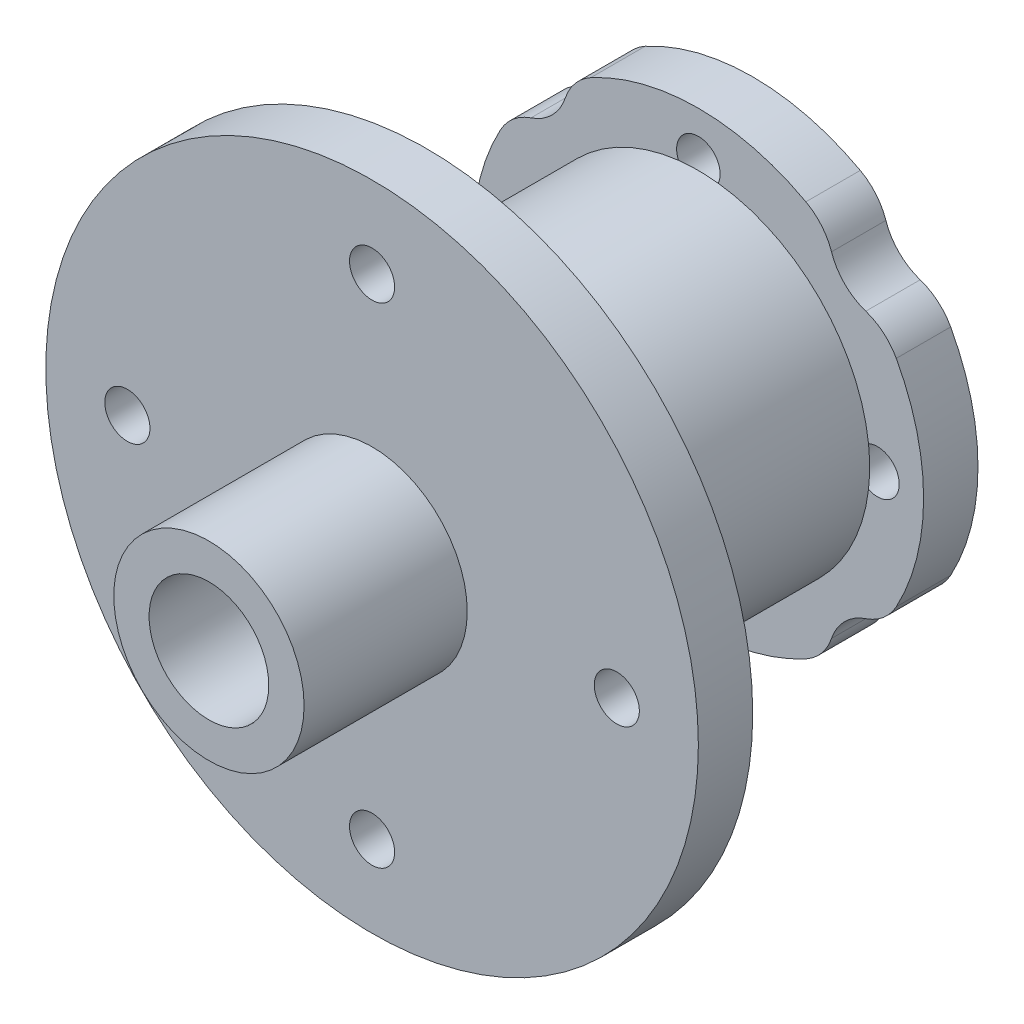
ISO-10303-21;
HEADER;
FILE_DESCRIPTION(('STEP AP214'),'2;1');
FILE_NAME('part.step','',(''),(''),'','','');
FILE_SCHEMA(('AUTOMOTIVE_DESIGN { 1 0 10303 214 1 1 1 1 }'));
ENDSEC;
DATA;
#1=APPLICATION_CONTEXT('core data for automotive mechanical design processes');
#2=APPLICATION_PROTOCOL_DEFINITION('international standard','automotive_design',2000,#1);
#3=PRODUCT_CONTEXT('',#1,'mechanical');
#4=PRODUCT('Part','Part','',(#3));
#5=PRODUCT_RELATED_PRODUCT_CATEGORY('part','',(#4));
#6=PRODUCT_DEFINITION_FORMATION('','',#4);
#7=PRODUCT_DEFINITION_CONTEXT('part definition',#1,'design');
#8=PRODUCT_DEFINITION('design','',#6,#7);
#9=PRODUCT_DEFINITION_SHAPE('','',#8);
#10=(LENGTH_UNIT() NAMED_UNIT(*) SI_UNIT(.MILLI.,.METRE.));
#11=(NAMED_UNIT(*) PLANE_ANGLE_UNIT() SI_UNIT($,.RADIAN.));
#12=(NAMED_UNIT(*) SI_UNIT($,.STERADIAN.) SOLID_ANGLE_UNIT());
#13=UNCERTAINTY_MEASURE_WITH_UNIT(LENGTH_MEASURE(1.E-05),#10,'distance_accuracy_value','');
#14=(GEOMETRIC_REPRESENTATION_CONTEXT(3) GLOBAL_UNCERTAINTY_ASSIGNED_CONTEXT((#13)) GLOBAL_UNIT_ASSIGNED_CONTEXT((#10,
#11,#12)) REPRESENTATION_CONTEXT('',''));
#15=CARTESIAN_POINT('',(0.,0.,0.));
#16=DIRECTION('',(0.,0.,1.));
#17=DIRECTION('',(1.,0.,0.));
#18=AXIS2_PLACEMENT_3D('',#15,#16,#17);
#19=CARTESIAN_POINT('',(0.,0.,10.));
#20=DIRECTION('',(0.,0.,-1.));
#21=DIRECTION('',(-1.,0.,0.));
#22=AXIS2_PLACEMENT_3D('',#19,#20,#21);
#23=CYLINDRICAL_SURFACE('',#22,41.42);
#24=CARTESIAN_POINT('',(0.,0.,10.));
#25=DIRECTION('',(0.,0.,1.));
#26=DIRECTION('',(1.,0.,0.));
#27=AXIS2_PLACEMENT_3D('',#24,#25,#26);
#28=CIRCLE('',#27,41.42);
#29=CARTESIAN_POINT('',(-36.3951118421899,19.7740292807129,10.));
#30=VERTEX_POINT('',#29);
#31=CARTESIAN_POINT('',(-36.3951118421899,-19.7740292807129,10.));
#32=VERTEX_POINT('',#31);
#33=EDGE_CURVE('E260',#30,#32,#28,.T.);
#34=ORIENTED_EDGE('',*,*,#33,.F.);
#35=DIRECTION('',(0.,0.,-1.));
#36=VECTOR('',#35,1.);
#37=CARTESIAN_POINT('',(-36.3951118421899,19.7740292807129,10.));
#38=LINE('',#37,#36);
#39=CARTESIAN_POINT('',(-36.3951118421899,19.7740292807129,0.));
#40=VERTEX_POINT('',#39);
#41=EDGE_CURVE('E262',#30,#40,#38,.T.);
#42=ORIENTED_EDGE('',*,*,#41,.T.);
#43=CARTESIAN_POINT('',(0.,0.,0.));
#44=DIRECTION('',(0.,0.,1.));
#45=DIRECTION('',(1.,0.,0.));
#46=AXIS2_PLACEMENT_3D('',#43,#44,#45);
#47=CIRCLE('',#46,41.42);
#48=CARTESIAN_POINT('',(-36.3951118421899,-19.7740292807129,0.));
#49=VERTEX_POINT('',#48);
#50=EDGE_CURVE('E211',#40,#49,#47,.T.);
#51=ORIENTED_EDGE('',*,*,#50,.T.);
#52=DIRECTION('',(0.,0.,-1.));
#53=VECTOR('',#52,1.);
#54=CARTESIAN_POINT('',(-36.3951118421899,-19.7740292807129,10.));
#55=LINE('',#54,#53);
#56=EDGE_CURVE('E236',#49,#32,#55,.F.);
#57=ORIENTED_EDGE('',*,*,#56,.T.);
#58=EDGE_LOOP('',(#34,#42,#51,#57));
#59=FACE_BOUND('',#58,.T.);
#60=ADVANCED_FACE('F39',(#59),#23,.T.);
#61=CARTESIAN_POINT('',(0.,0.,10.));
#62=DIRECTION('',(0.,0.,-1.));
#63=DIRECTION('',(-1.,0.,0.));
#64=AXIS2_PLACEMENT_3D('',#61,#62,#63);
#65=CYLINDRICAL_SURFACE('',#64,41.42);
#66=CARTESIAN_POINT('',(0.,0.,10.));
#67=DIRECTION('',(0.,0.,1.));
#68=DIRECTION('',(1.,0.,0.));
#69=AXIS2_PLACEMENT_3D('',#66,#67,#68);
#70=CIRCLE('',#69,41.42);
#71=CARTESIAN_POINT('',(-19.7740292807129,-36.3951118421899,10.));
#72=VERTEX_POINT('',#71);
#73=CARTESIAN_POINT('',(19.7740292807129,-36.3951118421899,10.));
#74=VERTEX_POINT('',#73);
#75=EDGE_CURVE('E430',#72,#74,#70,.T.);
#76=ORIENTED_EDGE('',*,*,#75,.F.);
#77=DIRECTION('',(0.,0.,-1.));
#78=VECTOR('',#77,1.);
#79=CARTESIAN_POINT('',(-19.7740292807129,-36.3951118421899,10.));
#80=LINE('',#79,#78);
#81=CARTESIAN_POINT('',(-19.7740292807129,-36.3951118421899,0.));
#82=VERTEX_POINT('',#81);
#83=EDGE_CURVE('E307',#72,#82,#80,.T.);
#84=ORIENTED_EDGE('',*,*,#83,.T.);
#85=CARTESIAN_POINT('',(0.,0.,0.));
#86=DIRECTION('',(0.,0.,1.));
#87=DIRECTION('',(1.,0.,0.));
#88=AXIS2_PLACEMENT_3D('',#85,#86,#87);
#89=CIRCLE('',#88,41.42);
#90=CARTESIAN_POINT('',(19.7740292807129,-36.3951118421899,0.));
#91=VERTEX_POINT('',#90);
#92=EDGE_CURVE('E239',#82,#91,#89,.T.);
#93=ORIENTED_EDGE('',*,*,#92,.T.);
#94=DIRECTION('',(0.,0.,-1.));
#95=VECTOR('',#94,1.);
#96=CARTESIAN_POINT('',(19.7740292807129,-36.3951118421899,10.));
#97=LINE('',#96,#95);
#98=EDGE_CURVE('E305',#91,#74,#97,.F.);
#99=ORIENTED_EDGE('',*,*,#98,.T.);
#100=EDGE_LOOP('',(#76,#84,#93,#99));
#101=FACE_BOUND('',#100,.T.);
#102=ADVANCED_FACE('F429',(#101),#65,.T.);
#103=CARTESIAN_POINT('',(0.,0.,10.));
#104=DIRECTION('',(0.,0.,-1.));
#105=DIRECTION('',(-1.,0.,0.));
#106=AXIS2_PLACEMENT_3D('',#103,#104,#105);
#107=CYLINDRICAL_SURFACE('',#106,41.42);
#108=CARTESIAN_POINT('',(0.,0.,10.));
#109=DIRECTION('',(0.,0.,1.));
#110=DIRECTION('',(1.,0.,0.));
#111=AXIS2_PLACEMENT_3D('',#108,#109,#110);
#112=CIRCLE('',#111,41.42);
#113=CARTESIAN_POINT('',(36.3951118421899,-19.7740292807129,10.));
#114=VERTEX_POINT('',#113);
#115=CARTESIAN_POINT('',(36.3951118421899,19.7740292807129,10.));
#116=VERTEX_POINT('',#115);
#117=EDGE_CURVE('E377',#114,#116,#112,.T.);
#118=ORIENTED_EDGE('',*,*,#117,.F.);
#119=DIRECTION('',(0.,0.,-1.));
#120=VECTOR('',#119,1.);
#121=CARTESIAN_POINT('',(36.3951118421899,-19.7740292807129,10.));
#122=LINE('',#121,#120);
#123=CARTESIAN_POINT('',(36.3951118421899,-19.7740292807129,0.));
#124=VERTEX_POINT('',#123);
#125=EDGE_CURVE('E312',#114,#124,#122,.T.);
#126=ORIENTED_EDGE('',*,*,#125,.T.);
#127=CARTESIAN_POINT('',(0.,0.,0.));
#128=DIRECTION('',(0.,0.,1.));
#129=DIRECTION('',(1.,0.,0.));
#130=AXIS2_PLACEMENT_3D('',#127,#128,#129);
#131=CIRCLE('',#130,41.42);
#132=CARTESIAN_POINT('',(36.3951118421899,19.7740292807129,0.));
#133=VERTEX_POINT('',#132);
#134=EDGE_CURVE('E242',#124,#133,#131,.T.);
#135=ORIENTED_EDGE('',*,*,#134,.T.);
#136=DIRECTION('',(0.,0.,-1.));
#137=VECTOR('',#136,1.);
#138=CARTESIAN_POINT('',(36.3951118421899,19.7740292807129,10.));
#139=LINE('',#138,#137);
#140=EDGE_CURVE('E310',#133,#116,#139,.F.);
#141=ORIENTED_EDGE('',*,*,#140,.T.);
#142=EDGE_LOOP('',(#118,#126,#135,#141));
#143=FACE_BOUND('',#142,.T.);
#144=ADVANCED_FACE('F375',(#143),#107,.T.);
#145=CARTESIAN_POINT('',(0.,-32.935,10.));
#146=DIRECTION('',(0.,0.,-1.));
#147=DIRECTION('',(-1.,0.,0.));
#148=AXIS2_PLACEMENT_3D('',#145,#146,#147);
#149=CYLINDRICAL_SURFACE('',#148,4.);
#150=CARTESIAN_POINT('',(0.,-32.935,10.));
#151=DIRECTION('',(0.,0.,1.));
#152=DIRECTION('',(1.,0.,0.));
#153=AXIS2_PLACEMENT_3D('',#150,#151,#152);
#154=CIRCLE('',#153,4.);
#155=CARTESIAN_POINT('',(3.6453496815203,-31.2883592682557,10.));
#156=VERTEX_POINT('',#155);
#157=CARTESIAN_POINT('',(-3.64534968152038,-31.2883592682556,10.));
#158=VERTEX_POINT('',#157);
#159=EDGE_CURVE('E232',#156,#158,#154,.T.);
#160=ORIENTED_EDGE('',*,*,#159,.T.);
#161=EDGE_CURVE('E184',#158,#156,#154,.T.);
#162=ORIENTED_EDGE('',*,*,#161,.T.);
#163=EDGE_LOOP('',(#160,#162));
#164=FACE_BOUND('',#163,.T.);
#165=CARTESIAN_POINT('',(0.,-32.935,0.));
#166=DIRECTION('',(0.,0.,1.));
#167=DIRECTION('',(1.,0.,0.));
#168=AXIS2_PLACEMENT_3D('',#165,#166,#167);
#169=CIRCLE('',#168,4.);
#170=CARTESIAN_POINT('',(3.99999999999996,-32.935,0.));
#171=VERTEX_POINT('',#170);
#172=EDGE_CURVE('E254',#171,#171,#169,.T.);
#173=ORIENTED_EDGE('',*,*,#172,.F.);
#174=EDGE_LOOP('',(#173));
#175=FACE_BOUND('',#174,.T.);
#176=ADVANCED_FACE('F438',(#164,#175),#149,.F.);
#177=CARTESIAN_POINT('',(32.935,0.,10.));
#178=DIRECTION('',(0.,0.,-1.));
#179=DIRECTION('',(-1.,0.,0.));
#180=AXIS2_PLACEMENT_3D('',#177,#178,#179);
#181=CYLINDRICAL_SURFACE('',#180,4.00000000000001);
#182=CARTESIAN_POINT('',(32.935,0.,10.));
#183=DIRECTION('',(0.,0.,1.));
#184=DIRECTION('',(1.,0.,0.));
#185=AXIS2_PLACEMENT_3D('',#182,#183,#184);
#186=CIRCLE('',#185,4.00000000000001);
#187=CARTESIAN_POINT('',(31.2883592682557,3.64534968152034,10.));
#188=VERTEX_POINT('',#187);
#189=CARTESIAN_POINT('',(31.2883592682556,-3.64534968152037,10.));
#190=VERTEX_POINT('',#189);
#191=EDGE_CURVE('E176',#188,#190,#186,.T.);
#192=ORIENTED_EDGE('',*,*,#191,.T.);
#193=EDGE_CURVE('E180',#190,#188,#186,.T.);
#194=ORIENTED_EDGE('',*,*,#193,.T.);
#195=EDGE_LOOP('',(#192,#194));
#196=FACE_BOUND('',#195,.T.);
#197=CARTESIAN_POINT('',(32.935,0.,0.));
#198=DIRECTION('',(0.,0.,1.));
#199=DIRECTION('',(1.,0.,0.));
#200=AXIS2_PLACEMENT_3D('',#197,#198,#199);
#201=CIRCLE('',#200,4.00000000000001);
#202=CARTESIAN_POINT('',(36.935,0.,0.));
#203=VERTEX_POINT('',#202);
#204=EDGE_CURVE('E251',#203,#203,#201,.T.);
#205=ORIENTED_EDGE('',*,*,#204,.F.);
#206=EDGE_LOOP('',(#205));
#207=FACE_BOUND('',#206,.T.);
#208=ADVANCED_FACE('F178',(#196,#207),#181,.F.);
#209=CARTESIAN_POINT('',(0.,32.935,10.));
#210=DIRECTION('',(0.,0.,-1.));
#211=DIRECTION('',(-1.,0.,0.));
#212=AXIS2_PLACEMENT_3D('',#209,#210,#211);
#213=CYLINDRICAL_SURFACE('',#212,4.);
#214=CARTESIAN_POINT('',(0.,32.935,10.));
#215=DIRECTION('',(0.,0.,1.));
#216=DIRECTION('',(1.,0.,0.));
#217=AXIS2_PLACEMENT_3D('',#214,#215,#216);
#218=CIRCLE('',#217,4.);
#219=CARTESIAN_POINT('',(-3.64534968152036,31.2883592682557,10.));
#220=VERTEX_POINT('',#219);
#221=CARTESIAN_POINT('',(3.64534968152033,31.2883592682557,10.));
#222=VERTEX_POINT('',#221);
#223=EDGE_CURVE('E193',#220,#222,#218,.T.);
#224=ORIENTED_EDGE('',*,*,#223,.T.);
#225=EDGE_CURVE('E218',#222,#220,#218,.T.);
#226=ORIENTED_EDGE('',*,*,#225,.T.);
#227=EDGE_LOOP('',(#224,#226));
#228=FACE_BOUND('',#227,.T.);
#229=CARTESIAN_POINT('',(0.,32.935,0.));
#230=DIRECTION('',(0.,0.,1.));
#231=DIRECTION('',(1.,0.,0.));
#232=AXIS2_PLACEMENT_3D('',#229,#230,#231);
#233=CIRCLE('',#232,4.);
#234=CARTESIAN_POINT('',(3.99999999999999,32.935,0.));
#235=VERTEX_POINT('',#234);
#236=EDGE_CURVE('E248',#235,#235,#233,.T.);
#237=ORIENTED_EDGE('',*,*,#236,.F.);
#238=EDGE_LOOP('',(#237));
#239=FACE_BOUND('',#238,.T.);
#240=ADVANCED_FACE('F223',(#228,#239),#213,.F.);
#241=CARTESIAN_POINT('',(0.,0.,10.));
#242=DIRECTION('',(0.,0.,-1.));
#243=DIRECTION('',(-1.,0.,0.));
#244=AXIS2_PLACEMENT_3D('',#241,#242,#243);
#245=CYLINDRICAL_SURFACE('',#244,41.42);
#246=CARTESIAN_POINT('',(0.,0.,10.));
#247=DIRECTION('',(0.,0.,1.));
#248=DIRECTION('',(1.,0.,0.));
#249=AXIS2_PLACEMENT_3D('',#246,#247,#248);
#250=CIRCLE('',#249,41.42);
#251=CARTESIAN_POINT('',(19.7740292807129,36.3951118421899,10.));
#252=VERTEX_POINT('',#251);
#253=CARTESIAN_POINT('',(-19.7740292807129,36.3951118421899,10.));
#254=VERTEX_POINT('',#253);
#255=EDGE_CURVE('E225',#252,#254,#250,.T.);
#256=ORIENTED_EDGE('',*,*,#255,.F.);
#257=DIRECTION('',(0.,0.,-1.));
#258=VECTOR('',#257,1.);
#259=CARTESIAN_POINT('',(19.7740292807129,36.3951118421899,10.));
#260=LINE('',#259,#258);
#261=CARTESIAN_POINT('',(19.7740292807129,36.3951118421899,0.));
#262=VERTEX_POINT('',#261);
#263=EDGE_CURVE('E317',#252,#262,#260,.T.);
#264=ORIENTED_EDGE('',*,*,#263,.T.);
#265=CARTESIAN_POINT('',(0.,0.,0.));
#266=DIRECTION('',(0.,0.,1.));
#267=DIRECTION('',(1.,0.,0.));
#268=AXIS2_PLACEMENT_3D('',#265,#266,#267);
#269=CIRCLE('',#268,41.42);
#270=CARTESIAN_POINT('',(-19.7740292807129,36.3951118421899,0.));
#271=VERTEX_POINT('',#270);
#272=EDGE_CURVE('E245',#262,#271,#269,.T.);
#273=ORIENTED_EDGE('',*,*,#272,.T.);
#274=DIRECTION('',(0.,0.,-1.));
#275=VECTOR('',#274,1.);
#276=CARTESIAN_POINT('',(-19.7740292807129,36.3951118421899,10.));
#277=LINE('',#276,#275);
#278=EDGE_CURVE('E315',#271,#254,#277,.F.);
#279=ORIENTED_EDGE('',*,*,#278,.T.);
#280=EDGE_LOOP('',(#256,#264,#273,#279));
#281=FACE_BOUND('',#280,.T.);
#282=ADVANCED_FACE('F395',(#281),#245,.T.);
#283=CARTESIAN_POINT('',(-32.935,0.,10.));
#284=DIRECTION('',(0.,0.,-1.));
#285=DIRECTION('',(-1.,0.,0.));
#286=AXIS2_PLACEMENT_3D('',#283,#284,#285);
#287=CYLINDRICAL_SURFACE('',#286,4.);
#288=CARTESIAN_POINT('',(-32.935,0.,10.));
#289=DIRECTION('',(0.,0.,1.));
#290=DIRECTION('',(1.,0.,0.));
#291=AXIS2_PLACEMENT_3D('',#288,#289,#290);
#292=CIRCLE('',#291,4.);
#293=CARTESIAN_POINT('',(-31.2883592682557,3.64534968152032,10.));
#294=VERTEX_POINT('',#293);
#295=CARTESIAN_POINT('',(-31.2883592682557,-3.64534968152033,10.));
#296=VERTEX_POINT('',#295);
#297=EDGE_CURVE('E220',#294,#296,#292,.T.);
#298=ORIENTED_EDGE('',*,*,#297,.T.);
#299=EDGE_CURVE('E60',#296,#294,#292,.T.);
#300=ORIENTED_EDGE('',*,*,#299,.T.);
#301=EDGE_LOOP('',(#298,#300));
#302=FACE_BOUND('',#301,.T.);
#303=CARTESIAN_POINT('',(-32.935,0.,0.));
#304=DIRECTION('',(0.,0.,1.));
#305=DIRECTION('',(1.,0.,0.));
#306=AXIS2_PLACEMENT_3D('',#303,#304,#305);
#307=CIRCLE('',#306,4.);
#308=CARTESIAN_POINT('',(-28.935,0.,0.));
#309=VERTEX_POINT('',#308);
#310=EDGE_CURVE('E257',#309,#309,#307,.T.);
#311=ORIENTED_EDGE('',*,*,#310,.F.);
#312=EDGE_LOOP('',(#311));
#313=FACE_BOUND('',#312,.T.);
#314=ADVANCED_FACE('F504',(#302,#313),#287,.F.);
#315=CARTESIAN_POINT('',(0.,0.,10.));
#316=DIRECTION('',(0.,0.,1.));
#317=DIRECTION('',(1.,0.,0.));
#318=AXIS2_PLACEMENT_3D('',#315,#316,#317);
#319=PLANE('',#318);
#320=CARTESIAN_POINT('',(0.,0.,10.));
#321=DIRECTION('',(0.,0.,1.));
#322=DIRECTION('',(1.,0.,0.));
#323=AXIS2_PLACEMENT_3D('',#320,#321,#322);
#324=CIRCLE('',#323,31.5);
#325=EDGE_CURVE('E192',#188,#222,#324,.T.);
#326=ORIENTED_EDGE('',*,*,#325,.F.);
#327=ORIENTED_EDGE('',*,*,#193,.F.);
#328=EDGE_CURVE('E189',#156,#190,#324,.T.);
#329=ORIENTED_EDGE('',*,*,#328,.F.);
#330=ORIENTED_EDGE('',*,*,#161,.F.);
#331=EDGE_CURVE('E54',#296,#158,#324,.T.);
#332=ORIENTED_EDGE('',*,*,#331,.F.);
#333=ORIENTED_EDGE('',*,*,#297,.F.);
#334=EDGE_CURVE('E47',#220,#294,#324,.T.);
#335=ORIENTED_EDGE('',*,*,#334,.F.);
#336=ORIENTED_EDGE('',*,*,#225,.F.);
#337=EDGE_LOOP('',(#326,#327,#329,#330,#332,#333,#335,#336));
#338=FACE_BOUND('',#337,.T.);
#339=CARTESIAN_POINT('',(-15.,27.6082668778756,10.));
#340=DIRECTION('',(0.,0.,1.));
#341=DIRECTION('',(1.,0.,0.));
#342=AXIS2_PLACEMENT_3D('',#339,#340,#341);
#343=CIRCLE('',#342,10.);
#344=CARTESIAN_POINT('',(-24.4817172150347,30.7858506539725,10.));
#345=VERTEX_POINT('',#344);
#346=EDGE_CURVE('E285',#254,#345,#343,.T.);
#347=ORIENTED_EDGE('',*,*,#346,.T.);
#348=CARTESIAN_POINT('',(-33.9634344300694,33.9634344300694,10.));
#349=DIRECTION('',(0.,0.,1.));
#350=DIRECTION('',(1.,0.,0.));
#351=AXIS2_PLACEMENT_3D('',#348,#349,#350);
#352=CIRCLE('',#351,10.);
#353=CARTESIAN_POINT('',(-30.7858506539725,24.4817172150347,10.));
#354=VERTEX_POINT('',#353);
#355=EDGE_CURVE('E346',#345,#354,#352,.F.);
#356=ORIENTED_EDGE('',*,*,#355,.T.);
#357=CARTESIAN_POINT('',(-27.6082668778755,15.,10.));
#358=DIRECTION('',(0.,0.,1.));
#359=DIRECTION('',(1.,0.,0.));
#360=AXIS2_PLACEMENT_3D('',#357,#358,#359);
#361=CIRCLE('',#360,10.);
#362=EDGE_CURVE('E303',#354,#30,#361,.T.);
#363=ORIENTED_EDGE('',*,*,#362,.T.);
#364=ORIENTED_EDGE('',*,*,#33,.T.);
#365=CARTESIAN_POINT('',(-27.6082668778755,-15.,10.));
#366=DIRECTION('',(0.,0.,1.));
#367=DIRECTION('',(1.,0.,0.));
#368=AXIS2_PLACEMENT_3D('',#365,#366,#367);
#369=CIRCLE('',#368,10.);
#370=CARTESIAN_POINT('',(-30.7858506539725,-24.4817172150347,10.));
#371=VERTEX_POINT('',#370);
#372=EDGE_CURVE('E300',#32,#371,#369,.T.);
#373=ORIENTED_EDGE('',*,*,#372,.T.);
#374=CARTESIAN_POINT('',(-33.9634344300694,-33.9634344300694,10.));
#375=DIRECTION('',(0.,0.,1.));
#376=DIRECTION('',(1.,0.,0.));
#377=AXIS2_PLACEMENT_3D('',#374,#375,#376);
#378=CIRCLE('',#377,10.);
#379=CARTESIAN_POINT('',(-24.4817172150347,-30.7858506539725,10.));
#380=VERTEX_POINT('',#379);
#381=EDGE_CURVE('E350',#371,#380,#378,.F.);
#382=ORIENTED_EDGE('',*,*,#381,.T.);
#383=CARTESIAN_POINT('',(-15.,-27.6082668778756,10.));
#384=DIRECTION('',(0.,0.,1.));
#385=DIRECTION('',(1.,0.,0.));
#386=AXIS2_PLACEMENT_3D('',#383,#384,#385);
#387=CIRCLE('',#386,10.);
#388=EDGE_CURVE('E298',#380,#72,#387,.T.);
#389=ORIENTED_EDGE('',*,*,#388,.T.);
#390=ORIENTED_EDGE('',*,*,#75,.T.);
#391=CARTESIAN_POINT('',(15.,-27.6082668778755,10.));
#392=DIRECTION('',(0.,0.,1.));
#393=DIRECTION('',(1.,0.,0.));
#394=AXIS2_PLACEMENT_3D('',#391,#392,#393);
#395=CIRCLE('',#394,10.);
#396=CARTESIAN_POINT('',(24.4817172150347,-30.7858506539725,10.));
#397=VERTEX_POINT('',#396);
#398=EDGE_CURVE('E295',#74,#397,#395,.T.);
#399=ORIENTED_EDGE('',*,*,#398,.T.);
#400=CARTESIAN_POINT('',(33.9634344300694,-33.9634344300694,10.));
#401=DIRECTION('',(0.,0.,1.));
#402=DIRECTION('',(1.,0.,0.));
#403=AXIS2_PLACEMENT_3D('',#400,#401,#402);
#404=CIRCLE('',#403,10.);
#405=CARTESIAN_POINT('',(30.7858506539725,-24.4817172150347,10.));
#406=VERTEX_POINT('',#405);
#407=EDGE_CURVE('E203',#397,#406,#404,.F.);
#408=ORIENTED_EDGE('',*,*,#407,.T.);
#409=CARTESIAN_POINT('',(27.6082668778755,-15.,10.));
#410=DIRECTION('',(0.,0.,1.));
#411=DIRECTION('',(1.,0.,0.));
#412=AXIS2_PLACEMENT_3D('',#409,#410,#411);
#413=CIRCLE('',#412,10.);
#414=EDGE_CURVE('E293',#406,#114,#413,.T.);
#415=ORIENTED_EDGE('',*,*,#414,.T.);
#416=ORIENTED_EDGE('',*,*,#117,.T.);
#417=CARTESIAN_POINT('',(27.6082668778755,15.,10.));
#418=DIRECTION('',(0.,0.,1.));
#419=DIRECTION('',(1.,0.,0.));
#420=AXIS2_PLACEMENT_3D('',#417,#418,#419);
#421=CIRCLE('',#420,10.);
#422=CARTESIAN_POINT('',(30.7858506539725,24.4817172150347,10.));
#423=VERTEX_POINT('',#422);
#424=EDGE_CURVE('E290',#116,#423,#421,.T.);
#425=ORIENTED_EDGE('',*,*,#424,.T.);
#426=CARTESIAN_POINT('',(33.9634344300694,33.9634344300694,10.));
#427=DIRECTION('',(0.,0.,1.));
#428=DIRECTION('',(1.,0.,0.));
#429=AXIS2_PLACEMENT_3D('',#426,#427,#428);
#430=CIRCLE('',#429,10.);
#431=CARTESIAN_POINT('',(24.4817172150347,30.7858506539725,10.));
#432=VERTEX_POINT('',#431);
#433=EDGE_CURVE('E342',#423,#432,#430,.F.);
#434=ORIENTED_EDGE('',*,*,#433,.T.);
#435=CARTESIAN_POINT('',(15.,27.6082668778755,10.));
#436=DIRECTION('',(0.,0.,1.));
#437=DIRECTION('',(1.,0.,0.));
#438=AXIS2_PLACEMENT_3D('',#435,#436,#437);
#439=CIRCLE('',#438,10.);
#440=EDGE_CURVE('E288',#432,#252,#439,.T.);
#441=ORIENTED_EDGE('',*,*,#440,.T.);
#442=ORIENTED_EDGE('',*,*,#255,.T.);
#443=EDGE_LOOP('',(#347,#356,#363,#364,#373,#382,#389,#390,#399,#408,#415,#416,#425,#434,#441,#442));
#444=FACE_BOUND('',#443,.T.);
#445=ADVANCED_FACE('F186',(#338,#444),#319,.T.);
#446=CARTESIAN_POINT('',(0.,0.,0.));
#447=DIRECTION('',(0.,0.,1.));
#448=DIRECTION('',(1.,0.,0.));
#449=AXIS2_PLACEMENT_3D('',#446,#447,#448);
#450=PLANE('',#449);
#451=ORIENTED_EDGE('',*,*,#50,.F.);
#452=CARTESIAN_POINT('',(-27.6082668778755,15.,0.));
#453=DIRECTION('',(0.,0.,1.));
#454=DIRECTION('',(1.,0.,0.));
#455=AXIS2_PLACEMENT_3D('',#452,#453,#454);
#456=CIRCLE('',#455,10.);
#457=CARTESIAN_POINT('',(-30.7858506539725,24.4817172150347,0.));
#458=VERTEX_POINT('',#457);
#459=EDGE_CURVE('E282',#40,#458,#456,.F.);
#460=ORIENTED_EDGE('',*,*,#459,.T.);
#461=CARTESIAN_POINT('',(-33.9634344300694,33.9634344300694,0.));
#462=DIRECTION('',(0.,0.,1.));
#463=DIRECTION('',(1.,0.,0.));
#464=AXIS2_PLACEMENT_3D('',#461,#462,#463);
#465=CIRCLE('',#464,10.);
#466=CARTESIAN_POINT('',(-24.4817172150347,30.7858506539725,0.));
#467=VERTEX_POINT('',#466);
#468=EDGE_CURVE('E344',#458,#467,#465,.T.);
#469=ORIENTED_EDGE('',*,*,#468,.T.);
#470=CARTESIAN_POINT('',(-15.,27.6082668778756,0.));
#471=DIRECTION('',(0.,0.,1.));
#472=DIRECTION('',(1.,0.,0.));
#473=AXIS2_PLACEMENT_3D('',#470,#471,#472);
#474=CIRCLE('',#473,10.);
#475=EDGE_CURVE('E265',#467,#271,#474,.F.);
#476=ORIENTED_EDGE('',*,*,#475,.T.);
#477=ORIENTED_EDGE('',*,*,#272,.F.);
#478=CARTESIAN_POINT('',(15.,27.6082668778755,0.));
#479=DIRECTION('',(0.,0.,1.));
#480=DIRECTION('',(1.,0.,0.));
#481=AXIS2_PLACEMENT_3D('',#478,#479,#480);
#482=CIRCLE('',#481,10.);
#483=CARTESIAN_POINT('',(24.4817172150347,30.7858506539725,0.));
#484=VERTEX_POINT('',#483);
#485=EDGE_CURVE('E267',#262,#484,#482,.F.);
#486=ORIENTED_EDGE('',*,*,#485,.T.);
#487=CARTESIAN_POINT('',(33.9634344300694,33.9634344300694,0.));
#488=DIRECTION('',(0.,0.,1.));
#489=DIRECTION('',(1.,0.,0.));
#490=AXIS2_PLACEMENT_3D('',#487,#488,#489);
#491=CIRCLE('',#490,10.);
#492=CARTESIAN_POINT('',(30.7858506539725,24.4817172150347,0.));
#493=VERTEX_POINT('',#492);
#494=EDGE_CURVE('E340',#484,#493,#491,.T.);
#495=ORIENTED_EDGE('',*,*,#494,.T.);
#496=CARTESIAN_POINT('',(27.6082668778755,15.,0.));
#497=DIRECTION('',(0.,0.,1.));
#498=DIRECTION('',(1.,0.,0.));
#499=AXIS2_PLACEMENT_3D('',#496,#497,#498);
#500=CIRCLE('',#499,10.);
#501=EDGE_CURVE('E270',#493,#133,#500,.F.);
#502=ORIENTED_EDGE('',*,*,#501,.T.);
#503=ORIENTED_EDGE('',*,*,#134,.F.);
#504=CARTESIAN_POINT('',(27.6082668778755,-15.,0.));
#505=DIRECTION('',(0.,0.,1.));
#506=DIRECTION('',(1.,0.,0.));
#507=AXIS2_PLACEMENT_3D('',#504,#505,#506);
#508=CIRCLE('',#507,10.);
#509=CARTESIAN_POINT('',(30.7858506539725,-24.4817172150347,0.));
#510=VERTEX_POINT('',#509);
#511=EDGE_CURVE('E272',#124,#510,#508,.F.);
#512=ORIENTED_EDGE('',*,*,#511,.T.);
#513=CARTESIAN_POINT('',(33.9634344300694,-33.9634344300694,0.));
#514=DIRECTION('',(0.,0.,1.));
#515=DIRECTION('',(1.,0.,0.));
#516=AXIS2_PLACEMENT_3D('',#513,#514,#515);
#517=CIRCLE('',#516,10.);
#518=CARTESIAN_POINT('',(24.4817172150347,-30.7858506539725,0.));
#519=VERTEX_POINT('',#518);
#520=EDGE_CURVE('E204',#510,#519,#517,.T.);
#521=ORIENTED_EDGE('',*,*,#520,.T.);
#522=CARTESIAN_POINT('',(15.,-27.6082668778755,0.));
#523=DIRECTION('',(0.,0.,1.));
#524=DIRECTION('',(1.,0.,0.));
#525=AXIS2_PLACEMENT_3D('',#522,#523,#524);
#526=CIRCLE('',#525,10.);
#527=EDGE_CURVE('E275',#519,#91,#526,.F.);
#528=ORIENTED_EDGE('',*,*,#527,.T.);
#529=ORIENTED_EDGE('',*,*,#92,.F.);
#530=CARTESIAN_POINT('',(-15.,-27.6082668778756,0.));
#531=DIRECTION('',(0.,0.,1.));
#532=DIRECTION('',(1.,0.,0.));
#533=AXIS2_PLACEMENT_3D('',#530,#531,#532);
#534=CIRCLE('',#533,10.);
#535=CARTESIAN_POINT('',(-24.4817172150347,-30.7858506539725,0.));
#536=VERTEX_POINT('',#535);
#537=EDGE_CURVE('E277',#82,#536,#534,.F.);
#538=ORIENTED_EDGE('',*,*,#537,.T.);
#539=CARTESIAN_POINT('',(-33.9634344300694,-33.9634344300694,0.));
#540=DIRECTION('',(0.,0.,1.));
#541=DIRECTION('',(1.,0.,0.));
#542=AXIS2_PLACEMENT_3D('',#539,#540,#541);
#543=CIRCLE('',#542,10.);
#544=CARTESIAN_POINT('',(-30.7858506539725,-24.4817172150347,0.));
#545=VERTEX_POINT('',#544);
#546=EDGE_CURVE('E348',#536,#545,#543,.T.);
#547=ORIENTED_EDGE('',*,*,#546,.T.);
#548=CARTESIAN_POINT('',(-27.6082668778755,-15.,0.));
#549=DIRECTION('',(0.,0.,1.));
#550=DIRECTION('',(1.,0.,0.));
#551=AXIS2_PLACEMENT_3D('',#548,#549,#550);
#552=CIRCLE('',#551,10.);
#553=EDGE_CURVE('E280',#545,#49,#552,.F.);
#554=ORIENTED_EDGE('',*,*,#553,.T.);
#555=EDGE_LOOP('',(#451,#460,#469,#476,#477,#486,#495,#502,#503,#512,#521,#528,#529,#538,#547,#554));
#556=FACE_BOUND('',#555,.T.);
#557=ORIENTED_EDGE('',*,*,#236,.T.);
#558=EDGE_LOOP('',(#557));
#559=FACE_BOUND('',#558,.T.);
#560=ORIENTED_EDGE('',*,*,#204,.T.);
#561=EDGE_LOOP('',(#560));
#562=FACE_BOUND('',#561,.T.);
#563=ORIENTED_EDGE('',*,*,#172,.T.);
#564=EDGE_LOOP('',(#563));
#565=FACE_BOUND('',#564,.T.);
#566=ORIENTED_EDGE('',*,*,#310,.T.);
#567=EDGE_LOOP('',(#566));
#568=FACE_BOUND('',#567,.T.);
#569=ADVANCED_FACE('F355',(#556,#559,#562,#565,#568),#450,.F.);
#570=CARTESIAN_POINT('',(-27.6082668778755,15.,10.));
#571=DIRECTION('',(0.,0.,-1.));
#572=DIRECTION('',(-1.,0.,0.));
#573=AXIS2_PLACEMENT_3D('',#570,#571,#572);
#574=CYLINDRICAL_SURFACE('',#573,10.);
#575=ORIENTED_EDGE('',*,*,#362,.F.);
#576=DIRECTION('',(0.,0.,-1.));
#577=VECTOR('',#576,1.);
#578=CARTESIAN_POINT('',(-30.7858506539725,24.4817172150347,10.));
#579=LINE('',#578,#577);
#580=EDGE_CURVE('E325',#354,#458,#579,.T.);
#581=ORIENTED_EDGE('',*,*,#580,.T.);
#582=ORIENTED_EDGE('',*,*,#459,.F.);
#583=ORIENTED_EDGE('',*,*,#41,.F.);
#584=EDGE_LOOP('',(#575,#581,#582,#583));
#585=FACE_BOUND('',#584,.T.);
#586=ADVANCED_FACE('F411',(#585),#574,.T.);
#587=CARTESIAN_POINT('',(-27.6082668778755,-15.,10.));
#588=DIRECTION('',(0.,0.,-1.));
#589=DIRECTION('',(-1.,0.,0.));
#590=AXIS2_PLACEMENT_3D('',#587,#588,#589);
#591=CYLINDRICAL_SURFACE('',#590,10.);
#592=ORIENTED_EDGE('',*,*,#553,.F.);
#593=DIRECTION('',(0.,0.,-1.));
#594=VECTOR('',#593,1.);
#595=CARTESIAN_POINT('',(-30.7858506539725,-24.4817172150347,10.));
#596=LINE('',#595,#594);
#597=EDGE_CURVE('E333',#545,#371,#596,.F.);
#598=ORIENTED_EDGE('',*,*,#597,.T.);
#599=ORIENTED_EDGE('',*,*,#372,.F.);
#600=ORIENTED_EDGE('',*,*,#56,.F.);
#601=EDGE_LOOP('',(#592,#598,#599,#600));
#602=FACE_BOUND('',#601,.T.);
#603=ADVANCED_FACE('F417',(#602),#591,.T.);
#604=CARTESIAN_POINT('',(-15.,-27.6082668778756,10.));
#605=DIRECTION('',(0.,0.,-1.));
#606=DIRECTION('',(-1.,0.,0.));
#607=AXIS2_PLACEMENT_3D('',#604,#605,#606);
#608=CYLINDRICAL_SURFACE('',#607,10.);
#609=ORIENTED_EDGE('',*,*,#388,.F.);
#610=DIRECTION('',(0.,0.,-1.));
#611=VECTOR('',#610,1.);
#612=CARTESIAN_POINT('',(-24.4817172150347,-30.7858506539725,10.));
#613=LINE('',#612,#611);
#614=EDGE_CURVE('E330',#380,#536,#613,.T.);
#615=ORIENTED_EDGE('',*,*,#614,.T.);
#616=ORIENTED_EDGE('',*,*,#537,.F.);
#617=ORIENTED_EDGE('',*,*,#83,.F.);
#618=EDGE_LOOP('',(#609,#615,#616,#617));
#619=FACE_BOUND('',#618,.T.);
#620=ADVANCED_FACE('F427',(#619),#608,.T.);
#621=CARTESIAN_POINT('',(15.,-27.6082668778755,10.));
#622=DIRECTION('',(0.,0.,-1.));
#623=DIRECTION('',(-1.,0.,0.));
#624=AXIS2_PLACEMENT_3D('',#621,#622,#623);
#625=CYLINDRICAL_SURFACE('',#624,10.);
#626=ORIENTED_EDGE('',*,*,#527,.F.);
#627=DIRECTION('',(0.,0.,-1.));
#628=VECTOR('',#627,1.);
#629=CARTESIAN_POINT('',(24.4817172150347,-30.7858506539725,10.));
#630=LINE('',#629,#628);
#631=EDGE_CURVE('E338',#519,#397,#630,.F.);
#632=ORIENTED_EDGE('',*,*,#631,.T.);
#633=ORIENTED_EDGE('',*,*,#398,.F.);
#634=ORIENTED_EDGE('',*,*,#98,.F.);
#635=EDGE_LOOP('',(#626,#632,#633,#634));
#636=FACE_BOUND('',#635,.T.);
#637=ADVANCED_FACE('F364',(#636),#625,.T.);
#638=CARTESIAN_POINT('',(27.6082668778755,-15.,10.));
#639=DIRECTION('',(0.,0.,-1.));
#640=DIRECTION('',(-1.,0.,0.));
#641=AXIS2_PLACEMENT_3D('',#638,#639,#640);
#642=CYLINDRICAL_SURFACE('',#641,10.);
#643=ORIENTED_EDGE('',*,*,#414,.F.);
#644=DIRECTION('',(0.,0.,-1.));
#645=VECTOR('',#644,1.);
#646=CARTESIAN_POINT('',(30.7858506539725,-24.4817172150347,10.));
#647=LINE('',#646,#645);
#648=EDGE_CURVE('E335',#406,#510,#647,.T.);
#649=ORIENTED_EDGE('',*,*,#648,.T.);
#650=ORIENTED_EDGE('',*,*,#511,.F.);
#651=ORIENTED_EDGE('',*,*,#125,.F.);
#652=EDGE_LOOP('',(#643,#649,#650,#651));
#653=FACE_BOUND('',#652,.T.);
#654=ADVANCED_FACE('F373',(#653),#642,.T.);
#655=CARTESIAN_POINT('',(27.6082668778755,15.,10.));
#656=DIRECTION('',(0.,0.,-1.));
#657=DIRECTION('',(-1.,0.,0.));
#658=AXIS2_PLACEMENT_3D('',#655,#656,#657);
#659=CYLINDRICAL_SURFACE('',#658,10.);
#660=ORIENTED_EDGE('',*,*,#501,.F.);
#661=DIRECTION('',(0.,0.,-1.));
#662=VECTOR('',#661,1.);
#663=CARTESIAN_POINT('',(30.7858506539725,24.4817172150347,10.));
#664=LINE('',#663,#662);
#665=EDGE_CURVE('E323',#493,#423,#664,.F.);
#666=ORIENTED_EDGE('',*,*,#665,.T.);
#667=ORIENTED_EDGE('',*,*,#424,.F.);
#668=ORIENTED_EDGE('',*,*,#140,.F.);
#669=EDGE_LOOP('',(#660,#666,#667,#668));
#670=FACE_BOUND('',#669,.T.);
#671=ADVANCED_FACE('F381',(#670),#659,.T.);
#672=CARTESIAN_POINT('',(15.,27.6082668778755,10.));
#673=DIRECTION('',(0.,0.,-1.));
#674=DIRECTION('',(-1.,0.,0.));
#675=AXIS2_PLACEMENT_3D('',#672,#673,#674);
#676=CYLINDRICAL_SURFACE('',#675,10.);
#677=ORIENTED_EDGE('',*,*,#440,.F.);
#678=DIRECTION('',(0.,0.,-1.));
#679=VECTOR('',#678,1.);
#680=CARTESIAN_POINT('',(24.4817172150347,30.7858506539725,10.));
#681=LINE('',#680,#679);
#682=EDGE_CURVE('E320',#432,#484,#681,.T.);
#683=ORIENTED_EDGE('',*,*,#682,.T.);
#684=ORIENTED_EDGE('',*,*,#485,.F.);
#685=ORIENTED_EDGE('',*,*,#263,.F.);
#686=EDGE_LOOP('',(#677,#683,#684,#685));
#687=FACE_BOUND('',#686,.T.);
#688=ADVANCED_FACE('F392',(#687),#676,.T.);
#689=CARTESIAN_POINT('',(-15.,27.6082668778756,10.));
#690=DIRECTION('',(0.,0.,-1.));
#691=DIRECTION('',(-1.,0.,0.));
#692=AXIS2_PLACEMENT_3D('',#689,#690,#691);
#693=CYLINDRICAL_SURFACE('',#692,10.);
#694=ORIENTED_EDGE('',*,*,#475,.F.);
#695=DIRECTION('',(0.,0.,-1.));
#696=VECTOR('',#695,1.);
#697=CARTESIAN_POINT('',(-24.4817172150347,30.7858506539725,10.));
#698=LINE('',#697,#696);
#699=EDGE_CURVE('E328',#467,#345,#698,.F.);
#700=ORIENTED_EDGE('',*,*,#699,.T.);
#701=ORIENTED_EDGE('',*,*,#346,.F.);
#702=ORIENTED_EDGE('',*,*,#278,.F.);
#703=EDGE_LOOP('',(#694,#700,#701,#702));
#704=FACE_BOUND('',#703,.T.);
#705=ADVANCED_FACE('F400',(#704),#693,.T.);
#706=CARTESIAN_POINT('',(33.9634344300694,33.9634344300694,10.));
#707=DIRECTION('',(0.,0.,1.));
#708=DIRECTION('',(1.,0.,0.));
#709=AXIS2_PLACEMENT_3D('',#706,#707,#708);
#710=CYLINDRICAL_SURFACE('',#709,10.);
#711=ORIENTED_EDGE('',*,*,#433,.F.);
#712=ORIENTED_EDGE('',*,*,#665,.F.);
#713=ORIENTED_EDGE('',*,*,#494,.F.);
#714=ORIENTED_EDGE('',*,*,#682,.F.);
#715=EDGE_LOOP('',(#711,#712,#713,#714));
#716=FACE_BOUND('',#715,.T.);
#717=ADVANCED_FACE('F385',(#716),#710,.F.);
#718=CARTESIAN_POINT('',(-33.9634344300694,33.9634344300694,10.));
#719=DIRECTION('',(0.,0.,1.));
#720=DIRECTION('',(1.,0.,0.));
#721=AXIS2_PLACEMENT_3D('',#718,#719,#720);
#722=CYLINDRICAL_SURFACE('',#721,10.);
#723=ORIENTED_EDGE('',*,*,#355,.F.);
#724=ORIENTED_EDGE('',*,*,#699,.F.);
#725=ORIENTED_EDGE('',*,*,#468,.F.);
#726=ORIENTED_EDGE('',*,*,#580,.F.);
#727=EDGE_LOOP('',(#723,#724,#725,#726));
#728=FACE_BOUND('',#727,.T.);
#729=ADVANCED_FACE('F404',(#728),#722,.F.);
#730=CARTESIAN_POINT('',(-33.9634344300694,-33.9634344300694,10.));
#731=DIRECTION('',(0.,0.,1.));
#732=DIRECTION('',(1.,0.,0.));
#733=AXIS2_PLACEMENT_3D('',#730,#731,#732);
#734=CYLINDRICAL_SURFACE('',#733,10.);
#735=ORIENTED_EDGE('',*,*,#381,.F.);
#736=ORIENTED_EDGE('',*,*,#597,.F.);
#737=ORIENTED_EDGE('',*,*,#546,.F.);
#738=ORIENTED_EDGE('',*,*,#614,.F.);
#739=EDGE_LOOP('',(#735,#736,#737,#738));
#740=FACE_BOUND('',#739,.T.);
#741=ADVANCED_FACE('F421',(#740),#734,.F.);
#742=CARTESIAN_POINT('',(33.9634344300694,-33.9634344300694,10.));
#743=DIRECTION('',(0.,0.,1.));
#744=DIRECTION('',(1.,0.,0.));
#745=AXIS2_PLACEMENT_3D('',#742,#743,#744);
#746=CYLINDRICAL_SURFACE('',#745,10.);
#747=ORIENTED_EDGE('',*,*,#407,.F.);
#748=ORIENTED_EDGE('',*,*,#631,.F.);
#749=ORIENTED_EDGE('',*,*,#520,.F.);
#750=ORIENTED_EDGE('',*,*,#648,.F.);
#751=EDGE_LOOP('',(#747,#748,#749,#750));
#752=FACE_BOUND('',#751,.T.);
#753=ADVANCED_FACE('F41',(#752),#746,.F.);
#754=CARTESIAN_POINT('',(0.,0.,10.));
#755=DIRECTION('',(0.,0.,1.));
#756=DIRECTION('',(1.,0.,0.));
#757=AXIS2_PLACEMENT_3D('',#754,#755,#756);
#758=PLANE('',#757);
#759=ORIENTED_EDGE('',*,*,#223,.F.);
#760=EDGE_CURVE('E208',#222,#220,#324,.T.);
#761=ORIENTED_EDGE('',*,*,#760,.F.);
#762=EDGE_LOOP('',(#759,#761));
#763=FACE_BOUND('',#762,.T.);
#764=ADVANCED_FACE('F228',(#763),#758,.F.);
#765=ORIENTED_EDGE('',*,*,#191,.F.);
#766=EDGE_CURVE('E194',#190,#188,#324,.T.);
#767=ORIENTED_EDGE('',*,*,#766,.F.);
#768=EDGE_LOOP('',(#765,#767));
#769=FACE_BOUND('',#768,.T.);
#770=ADVANCED_FACE('F195',(#769),#758,.F.);
#771=ORIENTED_EDGE('',*,*,#159,.F.);
#772=EDGE_CURVE('E197',#158,#156,#324,.T.);
#773=ORIENTED_EDGE('',*,*,#772,.F.);
#774=EDGE_LOOP('',(#771,#773));
#775=FACE_BOUND('',#774,.T.);
#776=ADVANCED_FACE('F474',(#775),#758,.F.);
#777=CARTESIAN_POINT('',(0.,0.,60.));
#778=DIRECTION('',(0.,0.,-1.));
#779=DIRECTION('',(-1.,0.,0.));
#780=AXIS2_PLACEMENT_3D('',#777,#778,#779);
#781=CYLINDRICAL_SURFACE('',#780,31.5);
#782=CARTESIAN_POINT('',(0.,0.,60.));
#783=DIRECTION('',(0.,0.,1.));
#784=DIRECTION('',(1.,0.,0.));
#785=AXIS2_PLACEMENT_3D('',#782,#783,#784);
#786=CIRCLE('',#785,31.5);
#787=CARTESIAN_POINT('',(31.5,0.,60.));
#788=VERTEX_POINT('',#787);
#789=EDGE_CURVE('E207',#788,#788,#786,.T.);
#790=ORIENTED_EDGE('',*,*,#789,.F.);
#791=EDGE_LOOP('',(#790));
#792=FACE_BOUND('',#791,.T.);
#793=ORIENTED_EDGE('',*,*,#325,.T.);
#794=ORIENTED_EDGE('',*,*,#760,.T.);
#795=ORIENTED_EDGE('',*,*,#334,.T.);
#796=EDGE_CURVE('E212',#294,#296,#324,.T.);
#797=ORIENTED_EDGE('',*,*,#796,.T.);
#798=ORIENTED_EDGE('',*,*,#331,.T.);
#799=ORIENTED_EDGE('',*,*,#772,.T.);
#800=ORIENTED_EDGE('',*,*,#328,.T.);
#801=ORIENTED_EDGE('',*,*,#766,.T.);
#802=EDGE_LOOP('',(#793,#794,#795,#797,#798,#799,#800,#801));
#803=FACE_BOUND('',#802,.T.);
#804=ADVANCED_FACE('F201',(#792,#803),#781,.T.);
#805=ORIENTED_EDGE('',*,*,#299,.F.);
#806=ORIENTED_EDGE('',*,*,#796,.F.);
#807=EDGE_LOOP('',(#805,#806));
#808=FACE_BOUND('',#807,.T.);
#809=ADVANCED_FACE('F470',(#808),#758,.F.);
#810=CARTESIAN_POINT('',(-44.9999999999987,-1.2762214690701E-12,70.));
#811=DIRECTION('',(0.,0.,-1.));
#812=DIRECTION('',(-1.,0.,0.));
#813=AXIS2_PLACEMENT_3D('',#810,#811,#812);
#814=CYLINDRICAL_SURFACE('',#813,4.15000000000204);
#815=CARTESIAN_POINT('',(-44.9999999999987,-1.2762214690701E-12,70.));
#816=DIRECTION('',(0.,0.,1.));
#817=DIRECTION('',(1.,0.,0.));
#818=AXIS2_PLACEMENT_3D('',#815,#816,#817);
#819=CIRCLE('',#818,4.15000000000204);
#820=CARTESIAN_POINT('',(-40.8499999999967,-1.2762214690701E-12,70.));
#821=VERTEX_POINT('',#820);
#822=EDGE_CURVE('E792',#821,#821,#819,.T.);
#823=ORIENTED_EDGE('',*,*,#822,.T.);
#824=EDGE_LOOP('',(#823));
#825=FACE_BOUND('',#824,.T.);
#826=CARTESIAN_POINT('',(-44.9999999999987,-1.2762214690701E-12,60.));
#827=DIRECTION('',(0.,0.,1.));
#828=DIRECTION('',(1.,0.,0.));
#829=AXIS2_PLACEMENT_3D('',#826,#827,#828);
#830=CIRCLE('',#829,4.15000000000204);
#831=CARTESIAN_POINT('',(-40.8499999999967,-1.2762214690701E-12,60.));
#832=VERTEX_POINT('',#831);
#833=EDGE_CURVE('E805',#832,#832,#830,.T.);
#834=ORIENTED_EDGE('',*,*,#833,.F.);
#835=EDGE_LOOP('',(#834));
#836=FACE_BOUND('',#835,.T.);
#837=ADVANCED_FACE('F478',(#825,#836),#814,.F.);
#838=CARTESIAN_POINT('',(0.,45.,70.));
#839=DIRECTION('',(0.,0.,-1.));
#840=DIRECTION('',(-1.,0.,0.));
#841=AXIS2_PLACEMENT_3D('',#838,#839,#840);
#842=CYLINDRICAL_SURFACE('',#841,4.15);
#843=CARTESIAN_POINT('',(0.,45.,70.));
#844=DIRECTION('',(0.,0.,1.));
#845=DIRECTION('',(1.,0.,0.));
#846=AXIS2_PLACEMENT_3D('',#843,#844,#845);
#847=CIRCLE('',#846,4.15);
#848=CARTESIAN_POINT('',(4.15,45.,70.));
#849=VERTEX_POINT('',#848);
#850=EDGE_CURVE('E789',#849,#849,#847,.T.);
#851=ORIENTED_EDGE('',*,*,#850,.T.);
#852=EDGE_LOOP('',(#851));
#853=FACE_BOUND('',#852,.T.);
#854=CARTESIAN_POINT('',(0.,45.,60.));
#855=DIRECTION('',(0.,0.,1.));
#856=DIRECTION('',(1.,0.,0.));
#857=AXIS2_PLACEMENT_3D('',#854,#855,#856);
#858=CIRCLE('',#857,4.15);
#859=CARTESIAN_POINT('',(4.15,45.,60.));
#860=VERTEX_POINT('',#859);
#861=EDGE_CURVE('E802',#860,#860,#858,.T.);
#862=ORIENTED_EDGE('',*,*,#861,.F.);
#863=EDGE_LOOP('',(#862));
#864=FACE_BOUND('',#863,.T.);
#865=ADVANCED_FACE('F484',(#853,#864),#842,.F.);
#866=CARTESIAN_POINT('',(45.0000000000013,1.27071055847394E-12,70.));
#867=DIRECTION('',(0.,0.,-1.));
#868=DIRECTION('',(-1.,0.,0.));
#869=AXIS2_PLACEMENT_3D('',#866,#867,#868);
#870=CYLINDRICAL_SURFACE('',#869,4.150000000001);
#871=CARTESIAN_POINT('',(45.0000000000013,1.27071055847394E-12,70.));
#872=DIRECTION('',(0.,0.,1.));
#873=DIRECTION('',(1.,0.,0.));
#874=AXIS2_PLACEMENT_3D('',#871,#872,#873);
#875=CIRCLE('',#874,4.150000000001);
#876=CARTESIAN_POINT('',(49.1500000000023,1.27071055847394E-12,70.));
#877=VERTEX_POINT('',#876);
#878=EDGE_CURVE('E785',#877,#877,#875,.T.);
#879=ORIENTED_EDGE('',*,*,#878,.T.);
#880=EDGE_LOOP('',(#879));
#881=FACE_BOUND('',#880,.T.);
#882=CARTESIAN_POINT('',(45.0000000000013,1.27071055847394E-12,60.));
#883=DIRECTION('',(0.,0.,1.));
#884=DIRECTION('',(1.,0.,0.));
#885=AXIS2_PLACEMENT_3D('',#882,#883,#884);
#886=CIRCLE('',#885,4.150000000001);
#887=CARTESIAN_POINT('',(49.1500000000023,1.27071055847394E-12,60.));
#888=VERTEX_POINT('',#887);
#889=EDGE_CURVE('E799',#888,#888,#886,.T.);
#890=ORIENTED_EDGE('',*,*,#889,.F.);
#891=EDGE_LOOP('',(#890));
#892=FACE_BOUND('',#891,.T.);
#893=ADVANCED_FACE('F666',(#881,#892),#870,.F.);
#894=CARTESIAN_POINT('',(2.54142111694787E-12,-45.,70.));
#895=DIRECTION('',(0.,0.,-1.));
#896=DIRECTION('',(-1.,0.,0.));
#897=AXIS2_PLACEMENT_3D('',#894,#895,#896);
#898=CYLINDRICAL_SURFACE('',#897,4.15000000000273);
#899=CARTESIAN_POINT('',(2.54142111694787E-12,-45.,70.));
#900=DIRECTION('',(0.,0.,1.));
#901=DIRECTION('',(1.,0.,0.));
#902=AXIS2_PLACEMENT_3D('',#899,#900,#901);
#903=CIRCLE('',#902,4.15000000000273);
#904=CARTESIAN_POINT('',(4.15000000000527,-45.,70.));
#905=VERTEX_POINT('',#904);
#906=EDGE_CURVE('E782',#905,#905,#903,.T.);
#907=ORIENTED_EDGE('',*,*,#906,.T.);
#908=EDGE_LOOP('',(#907));
#909=FACE_BOUND('',#908,.T.);
#910=CARTESIAN_POINT('',(2.54142111694787E-12,-45.,60.));
#911=DIRECTION('',(0.,0.,1.));
#912=DIRECTION('',(1.,0.,0.));
#913=AXIS2_PLACEMENT_3D('',#910,#911,#912);
#914=CIRCLE('',#913,4.15000000000273);
#915=CARTESIAN_POINT('',(4.15000000000527,-45.,60.));
#916=VERTEX_POINT('',#915);
#917=EDGE_CURVE('E780',#916,#916,#914,.T.);
#918=ORIENTED_EDGE('',*,*,#917,.F.);
#919=EDGE_LOOP('',(#918));
#920=FACE_BOUND('',#919,.T.);
#921=ADVANCED_FACE('F675',(#909,#920),#898,.F.);
#922=CARTESIAN_POINT('',(0.,0.,70.));
#923=DIRECTION('',(0.,0.,-1.));
#924=DIRECTION('',(-1.,0.,0.));
#925=AXIS2_PLACEMENT_3D('',#922,#923,#924);
#926=CYLINDRICAL_SURFACE('',#925,60.);
#927=CARTESIAN_POINT('',(0.,0.,70.));
#928=DIRECTION('',(0.,0.,1.));
#929=DIRECTION('',(1.,0.,0.));
#930=AXIS2_PLACEMENT_3D('',#927,#928,#929);
#931=CIRCLE('',#930,60.);
#932=CARTESIAN_POINT('',(60.,0.,70.));
#933=VERTEX_POINT('',#932);
#934=EDGE_CURVE('E198',#933,#933,#931,.T.);
#935=ORIENTED_EDGE('',*,*,#934,.F.);
#936=EDGE_LOOP('',(#935));
#937=FACE_BOUND('',#936,.T.);
#938=CARTESIAN_POINT('',(0.,0.,60.));
#939=DIRECTION('',(0.,0.,1.));
#940=DIRECTION('',(1.,0.,0.));
#941=AXIS2_PLACEMENT_3D('',#938,#939,#940);
#942=CIRCLE('',#941,60.);
#943=CARTESIAN_POINT('',(60.,0.,60.));
#944=VERTEX_POINT('',#943);
#945=EDGE_CURVE('E786',#944,#944,#942,.T.);
#946=ORIENTED_EDGE('',*,*,#945,.T.);
#947=EDGE_LOOP('',(#946));
#948=FACE_BOUND('',#947,.T.);
#949=ADVANCED_FACE('F684',(#937,#948),#926,.T.);
#950=CARTESIAN_POINT('',(0.,0.,70.));
#951=DIRECTION('',(0.,0.,1.));
#952=DIRECTION('',(1.,0.,0.));
#953=AXIS2_PLACEMENT_3D('',#950,#951,#952);
#954=PLANE('',#953);
#955=CARTESIAN_POINT('',(0.,0.,70.));
#956=DIRECTION('',(0.,0.,1.));
#957=DIRECTION('',(1.,0.,0.));
#958=AXIS2_PLACEMENT_3D('',#955,#956,#957);
#959=CIRCLE('',#958,17.5);
#960=CARTESIAN_POINT('',(17.5,0.,70.));
#961=VERTEX_POINT('',#960);
#962=EDGE_CURVE('E773',#961,#961,#959,.T.);
#963=ORIENTED_EDGE('',*,*,#962,.F.);
#964=EDGE_LOOP('',(#963));
#965=FACE_BOUND('',#964,.T.);
#966=ORIENTED_EDGE('',*,*,#906,.F.);
#967=EDGE_LOOP('',(#966));
#968=FACE_BOUND('',#967,.T.);
#969=ORIENTED_EDGE('',*,*,#878,.F.);
#970=EDGE_LOOP('',(#969));
#971=FACE_BOUND('',#970,.T.);
#972=ORIENTED_EDGE('',*,*,#850,.F.);
#973=EDGE_LOOP('',(#972));
#974=FACE_BOUND('',#973,.T.);
#975=ORIENTED_EDGE('',*,*,#822,.F.);
#976=EDGE_LOOP('',(#975));
#977=FACE_BOUND('',#976,.T.);
#978=ORIENTED_EDGE('',*,*,#934,.T.);
#979=EDGE_LOOP('',(#978));
#980=FACE_BOUND('',#979,.T.);
#981=ADVANCED_FACE('F692',(#965,#968,#971,#974,#977,#980),#954,.T.);
#982=CARTESIAN_POINT('',(0.,0.,60.));
#983=DIRECTION('',(0.,0.,1.));
#984=DIRECTION('',(1.,0.,0.));
#985=AXIS2_PLACEMENT_3D('',#982,#983,#984);
#986=PLANE('',#985);
#987=ORIENTED_EDGE('',*,*,#789,.T.);
#988=EDGE_LOOP('',(#987));
#989=FACE_BOUND('',#988,.T.);
#990=ORIENTED_EDGE('',*,*,#917,.T.);
#991=EDGE_LOOP('',(#990));
#992=FACE_BOUND('',#991,.T.);
#993=ORIENTED_EDGE('',*,*,#889,.T.);
#994=EDGE_LOOP('',(#993));
#995=FACE_BOUND('',#994,.T.);
#996=ORIENTED_EDGE('',*,*,#861,.T.);
#997=EDGE_LOOP('',(#996));
#998=FACE_BOUND('',#997,.T.);
#999=ORIENTED_EDGE('',*,*,#833,.T.);
#1000=EDGE_LOOP('',(#999));
#1001=FACE_BOUND('',#1000,.T.);
#1002=ORIENTED_EDGE('',*,*,#945,.F.);
#1003=EDGE_LOOP('',(#1002));
#1004=FACE_BOUND('',#1003,.T.);
#1005=ADVANCED_FACE('F701',(#989,#992,#995,#998,#1001,#1004),#986,.F.);
#1006=CARTESIAN_POINT('',(0.,0.,100.));
#1007=DIRECTION('',(0.,0.,1.));
#1008=DIRECTION('',(1.,0.,0.));
#1009=AXIS2_PLACEMENT_3D('',#1006,#1007,#1008);
#1010=PLANE('',#1009);
#1011=CARTESIAN_POINT('',(0.,0.,100.));
#1012=DIRECTION('',(0.,0.,1.));
#1013=DIRECTION('',(1.,0.,0.));
#1014=AXIS2_PLACEMENT_3D('',#1011,#1012,#1013);
#1015=CIRCLE('',#1014,17.5);
#1016=CARTESIAN_POINT('',(17.5,0.,100.));
#1017=VERTEX_POINT('',#1016);
#1018=EDGE_CURVE('E776',#1017,#1017,#1015,.T.);
#1019=ORIENTED_EDGE('',*,*,#1018,.T.);
#1020=EDGE_LOOP('',(#1019));
#1021=FACE_BOUND('',#1020,.T.);
#1022=CARTESIAN_POINT('',(0.,0.,100.));
#1023=DIRECTION('',(0.,0.,1.));
#1024=DIRECTION('',(1.,0.,0.));
#1025=AXIS2_PLACEMENT_3D('',#1022,#1023,#1024);
#1026=CIRCLE('',#1025,11.);
#1027=CARTESIAN_POINT('',(11.,0.,100.));
#1028=VERTEX_POINT('',#1027);
#1029=EDGE_CURVE('E770',#1028,#1028,#1026,.T.);
#1030=ORIENTED_EDGE('',*,*,#1029,.F.);
#1031=EDGE_LOOP('',(#1030));
#1032=FACE_BOUND('',#1031,.T.);
#1033=ADVANCED_FACE('F715',(#1021,#1032),#1010,.T.);
#1034=CARTESIAN_POINT('',(0.,0.,100.));
#1035=DIRECTION('',(0.,0.,-1.));
#1036=DIRECTION('',(-1.,0.,0.));
#1037=AXIS2_PLACEMENT_3D('',#1034,#1035,#1036);
#1038=CYLINDRICAL_SURFACE('',#1037,17.5);
#1039=ORIENTED_EDGE('',*,*,#1018,.F.);
#1040=EDGE_LOOP('',(#1039));
#1041=FACE_BOUND('',#1040,.T.);
#1042=ORIENTED_EDGE('',*,*,#962,.T.);
#1043=EDGE_LOOP('',(#1042));
#1044=FACE_BOUND('',#1043,.T.);
#1045=ADVANCED_FACE('F738',(#1041,#1044),#1038,.T.);
#1046=CARTESIAN_POINT('',(0.,0.,100.));
#1047=DIRECTION('',(0.,0.,-1.));
#1048=DIRECTION('',(-1.,0.,0.));
#1049=AXIS2_PLACEMENT_3D('',#1046,#1047,#1048);
#1050=CYLINDRICAL_SURFACE('',#1049,11.);
#1051=ORIENTED_EDGE('',*,*,#1029,.T.);
#1052=EDGE_LOOP('',(#1051));
#1053=FACE_BOUND('',#1052,.T.);
#1054=CARTESIAN_POINT('',(0.,0.,70.));
#1055=DIRECTION('',(0.,0.,1.));
#1056=DIRECTION('',(1.,0.,0.));
#1057=AXIS2_PLACEMENT_3D('',#1054,#1055,#1056);
#1058=CIRCLE('',#1057,11.);
#1059=CARTESIAN_POINT('',(11.,0.,70.));
#1060=VERTEX_POINT('',#1059);
#1061=EDGE_CURVE('E11',#1060,#1060,#1058,.F.);
#1062=ORIENTED_EDGE('',*,*,#1061,.T.);
#1063=EDGE_LOOP('',(#1062));
#1064=FACE_BOUND('',#1063,.T.);
#1065=ADVANCED_FACE('F726',(#1053,#1064),#1050,.F.);
#1066=ORIENTED_EDGE('',*,*,#1061,.F.);
#1067=EDGE_LOOP('',(#1066));
#1068=FACE_BOUND('',#1067,.T.);
#1069=ADVANCED_FACE('F704',(#1068),#954,.T.);
#1070=CLOSED_SHELL('',(#60,#102,#144,#176,#208,#240,#282,#314,#445,#569,#586,#603,#620,#637,
#654,#671,#688,#705,#717,#729,#741,#753,#764,#770,#776,#804,#809,#837,#865,#893,#921,#949,#981,
#1005,#1033,#1045,#1065,#1069));
#1071=MANIFOLD_SOLID_BREP('B2',#1070);
#1072=ADVANCED_BREP_SHAPE_REPRESENTATION('',(#18,#1071),#14);
#1073=SHAPE_DEFINITION_REPRESENTATION(#9,#1072);
ENDSEC;
END-ISO-10303-21;
